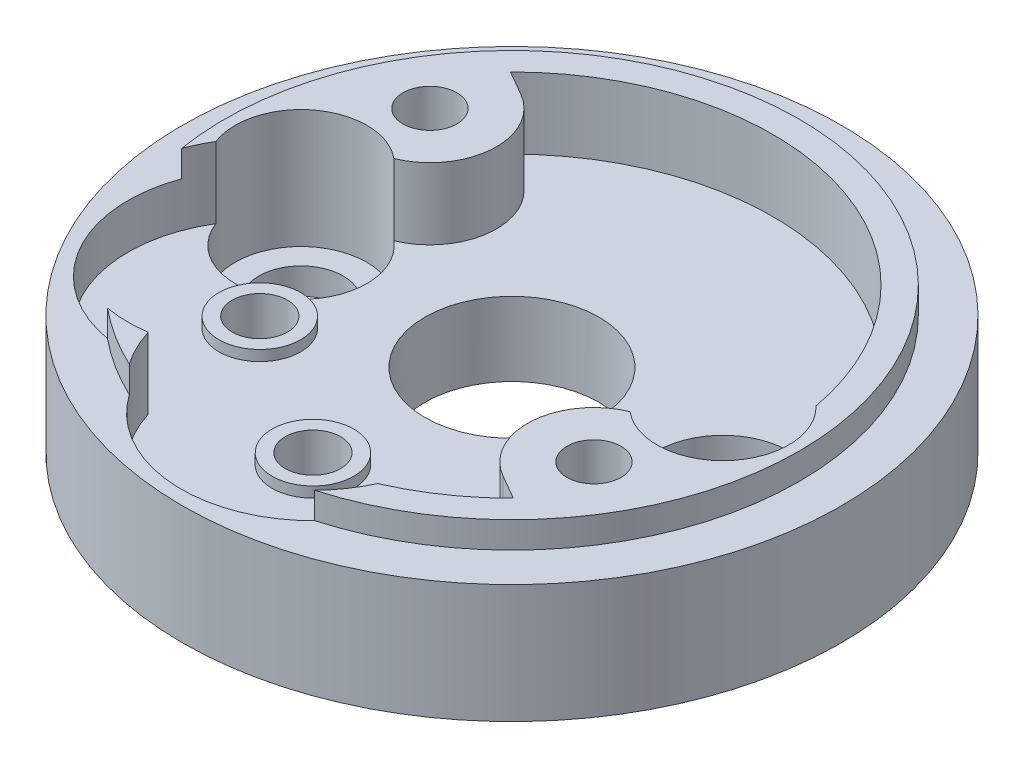
ISO-10303-21;
HEADER;
FILE_DESCRIPTION(('STEP AP214'),'2;1');
FILE_NAME('part.step','',(''),(''),'','','');
FILE_SCHEMA(('AUTOMOTIVE_DESIGN { 1 0 10303 214 1 1 1 1 }'));
ENDSEC;
DATA;
#1=APPLICATION_CONTEXT('core data for automotive mechanical design processes');
#2=APPLICATION_PROTOCOL_DEFINITION('international standard','automotive_design',2000,#1);
#3=PRODUCT_CONTEXT('',#1,'mechanical');
#4=PRODUCT('Part','Part','',(#3));
#5=PRODUCT_RELATED_PRODUCT_CATEGORY('part','',(#4));
#6=PRODUCT_DEFINITION_FORMATION('','',#4);
#7=PRODUCT_DEFINITION_CONTEXT('part definition',#1,'design');
#8=PRODUCT_DEFINITION('design','',#6,#7);
#9=PRODUCT_DEFINITION_SHAPE('','',#8);
#10=(LENGTH_UNIT() NAMED_UNIT(*) SI_UNIT(.MILLI.,.METRE.));
#11=(NAMED_UNIT(*) PLANE_ANGLE_UNIT() SI_UNIT($,.RADIAN.));
#12=(NAMED_UNIT(*) SI_UNIT($,.STERADIAN.) SOLID_ANGLE_UNIT());
#13=UNCERTAINTY_MEASURE_WITH_UNIT(LENGTH_MEASURE(1.E-05),#10,'distance_accuracy_value','');
#14=(GEOMETRIC_REPRESENTATION_CONTEXT(3) GLOBAL_UNCERTAINTY_ASSIGNED_CONTEXT((#13)) GLOBAL_UNIT_ASSIGNED_CONTEXT((#10,
#11,#12)) REPRESENTATION_CONTEXT('',''));
#15=CARTESIAN_POINT('',(0.,0.,0.));
#16=DIRECTION('',(0.,0.,1.));
#17=DIRECTION('',(1.,0.,0.));
#18=AXIS2_PLACEMENT_3D('',#15,#16,#17);
#19=CARTESIAN_POINT('',(0.,-28.0014285349873,0.));
#20=DIRECTION('',(0.,1.,0.));
#21=DIRECTION('',(0.,0.,1.));
#22=AXIS2_PLACEMENT_3D('',#19,#20,#21);
#23=CYLINDRICAL_SURFACE('',#22,9.9);
#24=DIRECTION('',(0.,-1.,0.));
#25=VECTOR('',#24,1.);
#26=CARTESIAN_POINT('',(3.97122345436406,4.15,9.06859329088634));
#27=LINE('',#26,#25);
#28=CARTESIAN_POINT('',(3.97122345436406,5.5,9.06859329088634));
#29=VERTEX_POINT('',#28);
#30=CARTESIAN_POINT('',(3.97122345436406,2.8,9.06859329088634));
#31=VERTEX_POINT('',#30);
#32=EDGE_CURVE('E186',#29,#31,#27,.T.);
#33=ORIENTED_EDGE('',*,*,#32,.F.);
#34=CARTESIAN_POINT('',(0.,5.5,0.));
#35=DIRECTION('',(0.,1.,0.));
#36=DIRECTION('',(0.,0.,1.));
#37=AXIS2_PLACEMENT_3D('',#34,#35,#36);
#38=CIRCLE('',#37,9.9);
#39=CARTESIAN_POINT('',(7.02760140167179,5.5,6.97300642042015));
#40=VERTEX_POINT('',#39);
#41=EDGE_CURVE('E287',#29,#40,#38,.T.);
#42=ORIENTED_EDGE('',*,*,#41,.T.);
#43=DIRECTION('',(0.,-1.,0.));
#44=VECTOR('',#43,1.);
#45=CARTESIAN_POINT('',(7.02760140167179,12.414266167055,6.97300642042015));
#46=LINE('',#45,#44);
#47=CARTESIAN_POINT('',(7.02760140167179,2.8,6.97300642042015));
#48=VERTEX_POINT('',#47);
#49=EDGE_CURVE('E225',#40,#48,#46,.T.);
#50=ORIENTED_EDGE('',*,*,#49,.T.);
#51=CARTESIAN_POINT('',(0.,2.8,0.));
#52=DIRECTION('',(0.,1.,0.));
#53=DIRECTION('',(0.,0.,1.));
#54=AXIS2_PLACEMENT_3D('',#51,#52,#53);
#55=CIRCLE('',#54,9.9);
#56=EDGE_CURVE('E290',#48,#31,#55,.F.);
#57=ORIENTED_EDGE('',*,*,#56,.T.);
#58=EDGE_LOOP('',(#33,#42,#50,#57));
#59=FACE_BOUND('',#58,.T.);
#60=ADVANCED_FACE('F37',(#59),#23,.F.);
#61=CARTESIAN_POINT('',(0.,4.5,0.));
#62=DIRECTION('',(0.,1.,0.));
#63=DIRECTION('',(0.,0.,1.));
#64=AXIS2_PLACEMENT_3D('',#61,#62,#63);
#65=CYLINDRICAL_SURFACE('',#64,10.9);
#66=CARTESIAN_POINT('',(0.,5.5,0.));
#67=DIRECTION('',(0.,1.,0.));
#68=DIRECTION('',(0.,0.,1.));
#69=AXIS2_PLACEMENT_3D('',#66,#67,#68);
#70=CIRCLE('',#69,10.9);
#71=CARTESIAN_POINT('',(2.99765477895542,5.5,10.4796977926945));
#72=VERTEX_POINT('',#71);
#73=CARTESIAN_POINT('',(-10.754717449331,5.5,1.7737115281397));
#74=VERTEX_POINT('',#73);
#75=EDGE_CURVE('E299',#72,#74,#70,.T.);
#76=ORIENTED_EDGE('',*,*,#75,.F.);
#77=DIRECTION('',(0.,-1.,0.));
#78=VECTOR('',#77,1.);
#79=CARTESIAN_POINT('',(2.99765477895542,4.15,10.4796977926945));
#80=LINE('',#79,#78);
#81=CARTESIAN_POINT('',(2.99765477895542,4.5,10.4796977926945));
#82=VERTEX_POINT('',#81);
#83=EDGE_CURVE('E183',#72,#82,#80,.T.);
#84=ORIENTED_EDGE('',*,*,#83,.T.);
#85=CARTESIAN_POINT('',(0.,4.5,0.));
#86=DIRECTION('',(0.,1.,0.));
#87=DIRECTION('',(0.,0.,1.));
#88=AXIS2_PLACEMENT_3D('',#85,#86,#87);
#89=CIRCLE('',#88,10.9);
#90=CARTESIAN_POINT('',(-10.754717449331,4.5,1.7737115281397));
#91=VERTEX_POINT('',#90);
#92=EDGE_CURVE('E294',#82,#91,#89,.T.);
#93=ORIENTED_EDGE('',*,*,#92,.T.);
#94=DIRECTION('',(0.,-1.,0.));
#95=VECTOR('',#94,1.);
#96=CARTESIAN_POINT('',(-10.754717449331,4.15,1.7737115281397));
#97=LINE('',#96,#95);
#98=EDGE_CURVE('E162',#91,#74,#97,.F.);
#99=ORIENTED_EDGE('',*,*,#98,.T.);
#100=EDGE_LOOP('',(#76,#84,#93,#99));
#101=FACE_BOUND('',#100,.T.);
#102=ADVANCED_FACE('F404',(#101),#65,.T.);
#103=CARTESIAN_POINT('',(-6.91343796701989,4.5,8.42700275757448));
#104=VERTEX_POINT('',#103);
#105=CARTESIAN_POINT('',(-4.65937752600439,4.5,9.8539434273881));
#106=VERTEX_POINT('',#105);
#107=EDGE_CURVE('E298',#104,#106,#89,.T.);
#108=ORIENTED_EDGE('',*,*,#107,.T.);
#109=DIRECTION('',(0.,-1.,0.));
#110=VECTOR('',#109,1.);
#111=CARTESIAN_POINT('',(-4.65937752600439,4.15,9.8539434273881));
#112=LINE('',#111,#110);
#113=CARTESIAN_POINT('',(-4.65937752600439,5.5,9.8539434273881));
#114=VERTEX_POINT('',#113);
#115=EDGE_CURVE('E178',#106,#114,#112,.F.);
#116=ORIENTED_EDGE('',*,*,#115,.T.);
#117=CARTESIAN_POINT('',(-6.91343796701989,5.5,8.42700275757448));
#118=VERTEX_POINT('',#117);
#119=EDGE_CURVE('E165',#118,#114,#70,.T.);
#120=ORIENTED_EDGE('',*,*,#119,.F.);
#121=DIRECTION('',(0.,-1.,0.));
#122=VECTOR('',#121,1.);
#123=CARTESIAN_POINT('',(-6.91343796701989,4.15,8.42700275757448));
#124=LINE('',#123,#122);
#125=EDGE_CURVE('E149',#118,#104,#124,.T.);
#126=ORIENTED_EDGE('',*,*,#125,.T.);
#127=EDGE_LOOP('',(#108,#116,#120,#126));
#128=FACE_BOUND('',#127,.T.);
#129=ADVANCED_FACE('F409',(#128),#65,.T.);
#130=CARTESIAN_POINT('',(0.,5.5,0.));
#131=DIRECTION('',(0.,1.,0.));
#132=DIRECTION('',(0.,0.,1.));
#133=AXIS2_PLACEMENT_3D('',#130,#131,#132);
#134=PLANE('',#133);
#135=CARTESIAN_POINT('',(7.36121593216775,5.5,4.24999999999996));
#136=DIRECTION('',(0.,1.,0.));
#137=DIRECTION('',(0.,0.,1.));
#138=AXIS2_PLACEMENT_3D('',#135,#136,#137);
#139=CIRCLE('',#138,1.025);
#140=CARTESIAN_POINT('',(7.36121593216775,5.5,5.27499999999996));
#141=VERTEX_POINT('',#140);
#142=EDGE_CURVE('E211',#141,#141,#139,.T.);
#143=ORIENTED_EDGE('',*,*,#142,.F.);
#144=EDGE_LOOP('',(#143));
#145=FACE_BOUND('',#144,.T.);
#146=CARTESIAN_POINT('',(-7.36121593216775,5.5,-4.24999999999996));
#147=DIRECTION('',(0.,1.,0.));
#148=DIRECTION('',(0.,0.,1.));
#149=AXIS2_PLACEMENT_3D('',#146,#147,#148);
#150=CIRCLE('',#149,1.025);
#151=CARTESIAN_POINT('',(-7.36121593216775,5.5,-3.22499999999996));
#152=VERTEX_POINT('',#151);
#153=EDGE_CURVE('E232',#152,#152,#150,.T.);
#154=ORIENTED_EDGE('',*,*,#153,.F.);
#155=EDGE_LOOP('',(#154));
#156=FACE_BOUND('',#155,.T.);
#157=ORIENTED_EDGE('',*,*,#41,.F.);
#158=CARTESIAN_POINT('',(-0.570159054725856,5.5,6.97674126310516));
#159=DIRECTION('',(0.,1.,0.));
#160=DIRECTION('',(0.,0.,1.));
#161=AXIS2_PLACEMENT_3D('',#158,#159,#160);
#162=CIRCLE('',#161,5.);
#163=EDGE_CURVE('E166',#72,#29,#162,.T.);
#164=ORIENTED_EDGE('',*,*,#163,.F.);
#165=ORIENTED_EDGE('',*,*,#75,.T.);
#166=CARTESIAN_POINT('',(-6.06217782649109,5.5,3.49999999999996));
#167=DIRECTION('',(0.,1.,0.));
#168=DIRECTION('',(0.,0.,1.));
#169=AXIS2_PLACEMENT_3D('',#166,#167,#168);
#170=CIRCLE('',#169,5.);
#171=CARTESIAN_POINT('',(-10.3326244465103,5.5,0.899368217996572));
#172=VERTEX_POINT('',#171);
#173=EDGE_CURVE('E154',#172,#74,#170,.T.);
#174=ORIENTED_EDGE('',*,*,#173,.F.);
#175=CARTESIAN_POINT('',(-8.,5.5,0.));
#176=DIRECTION('',(0.,-1.,0.));
#177=DIRECTION('',(0.,0.,-1.));
#178=AXIS2_PLACEMENT_3D('',#175,#176,#177);
#179=CIRCLE('',#178,2.5);
#180=CARTESIAN_POINT('',(-6.39533392961425,5.5,-1.91704115828345));
#181=VERTEX_POINT('',#180);
#182=EDGE_CURVE('E263',#172,#181,#179,.T.);
#183=ORIENTED_EDGE('',*,*,#182,.T.);
#184=CARTESIAN_POINT('',(-7.36121593216775,5.5,-4.24999999999996));
#185=DIRECTION('',(0.,1.,0.));
#186=DIRECTION('',(0.,0.,1.));
#187=AXIS2_PLACEMENT_3D('',#184,#185,#186);
#188=CIRCLE('',#187,2.525);
#189=CARTESIAN_POINT('',(-6.09871593216776,5.5,-6.43671414455567));
#190=VERTEX_POINT('',#189);
#191=EDGE_CURVE('E238',#181,#190,#188,.T.);
#192=ORIENTED_EDGE('',*,*,#191,.T.);
#193=DIRECTION('',(-0.866025403784442,0.,-0.499999999999995));
#194=VECTOR('',#193,1.);
#195=CARTESIAN_POINT('',(-7.02760140167179,5.5,-6.97300642042015));
#196=LINE('',#195,#194);
#197=CARTESIAN_POINT('',(-7.02760140167179,5.5,-6.97300642042015));
#198=VERTEX_POINT('',#197);
#199=EDGE_CURVE('E235',#190,#198,#196,.T.);
#200=ORIENTED_EDGE('',*,*,#199,.T.);
#201=CARTESIAN_POINT('',(9.735,5.5,-1.79993749891489));
#202=VERTEX_POINT('',#201);
#203=EDGE_CURVE('E289',#202,#198,#38,.T.);
#204=ORIENTED_EDGE('',*,*,#203,.F.);
#205=CARTESIAN_POINT('',(8.,5.5,0.));
#206=DIRECTION('',(0.,-1.,0.));
#207=DIRECTION('',(0.,0.,-1.));
#208=AXIS2_PLACEMENT_3D('',#205,#206,#207);
#209=CIRCLE('',#208,2.5);
#210=CARTESIAN_POINT('',(6.39533392961425,5.5,1.91704115828345));
#211=VERTEX_POINT('',#210);
#212=EDGE_CURVE('E269',#202,#211,#209,.T.);
#213=ORIENTED_EDGE('',*,*,#212,.T.);
#214=CARTESIAN_POINT('',(7.36121593216775,5.5,4.24999999999996));
#215=DIRECTION('',(0.,1.,0.));
#216=DIRECTION('',(0.,0.,1.));
#217=AXIS2_PLACEMENT_3D('',#214,#215,#216);
#218=CIRCLE('',#217,2.525);
#219=CARTESIAN_POINT('',(6.09871593216776,5.5,6.43671414455567));
#220=VERTEX_POINT('',#219);
#221=EDGE_CURVE('E217',#211,#220,#218,.T.);
#222=ORIENTED_EDGE('',*,*,#221,.T.);
#223=DIRECTION('',(0.866025403784442,0.,0.499999999999995));
#224=VECTOR('',#223,1.);
#225=CARTESIAN_POINT('',(7.02760140167179,5.5,6.97300642042015));
#226=LINE('',#225,#224);
#227=EDGE_CURVE('E214',#220,#40,#226,.T.);
#228=ORIENTED_EDGE('',*,*,#227,.T.);
#229=EDGE_LOOP('',(#157,#164,#165,#174,#183,#192,#200,#204,#213,#222,#228));
#230=FACE_BOUND('',#229,.T.);
#231=ADVANCED_FACE('F342',(#145,#156,#230),#134,.T.);
#232=CARTESIAN_POINT('',(-8.,5.5,0.));
#233=DIRECTION('',(0.,-1.,0.));
#234=DIRECTION('',(0.,0.,-1.));
#235=AXIS2_PLACEMENT_3D('',#232,#233,#234);
#236=CYLINDRICAL_SURFACE('',#235,2.5);
#237=CARTESIAN_POINT('',(-8.,1.,0.));
#238=DIRECTION('',(0.,-1.,0.));
#239=DIRECTION('',(0.,0.,-1.));
#240=AXIS2_PLACEMENT_3D('',#237,#238,#239);
#241=CIRCLE('',#240,2.5);
#242=CARTESIAN_POINT('',(-8.,1.,-2.5));
#243=VERTEX_POINT('',#242);
#244=EDGE_CURVE('E266',#243,#243,#241,.T.);
#245=ORIENTED_EDGE('',*,*,#244,.T.);
#246=EDGE_LOOP('',(#245));
#247=FACE_BOUND('',#246,.T.);
#248=DIRECTION('',(0.,-1.,0.));
#249=VECTOR('',#248,1.);
#250=CARTESIAN_POINT('',(-10.3326244465103,4.15,0.899368217996571));
#251=LINE('',#250,#249);
#252=CARTESIAN_POINT('',(-10.3326244465103,2.8,0.899368217996573));
#253=VERTEX_POINT('',#252);
#254=EDGE_CURVE('E13',#253,#172,#251,.F.);
#255=ORIENTED_EDGE('',*,*,#254,.F.);
#256=CARTESIAN_POINT('',(-8.,2.8,0.));
#257=DIRECTION('',(0.,1.,0.));
#258=DIRECTION('',(0.,0.,1.));
#259=AXIS2_PLACEMENT_3D('',#256,#257,#258);
#260=CIRCLE('',#259,2.5);
#261=CARTESIAN_POINT('',(-7.0660193673345,2.8,2.31898257384693));
#262=VERTEX_POINT('',#261);
#263=EDGE_CURVE('E45',#253,#262,#260,.T.);
#264=ORIENTED_EDGE('',*,*,#263,.T.);
#265=CARTESIAN_POINT('',(-8.,2.8,0.));
#266=DIRECTION('',(0.,1.,0.));
#267=DIRECTION('',(0.,0.,1.));
#268=AXIS2_PLACEMENT_3D('',#265,#266,#267);
#269=CIRCLE('',#268,2.5);
#270=CARTESIAN_POINT('',(-6.53032286325913,2.8,2.02238698417023));
#271=VERTEX_POINT('',#270);
#272=EDGE_CURVE('E204',#271,#262,#269,.F.);
#273=ORIENTED_EDGE('',*,*,#272,.F.);
#274=CARTESIAN_POINT('',(-6.39533392961425,2.8,-1.91704115828345));
#275=VERTEX_POINT('',#274);
#276=EDGE_CURVE('E315',#271,#275,#260,.T.);
#277=ORIENTED_EDGE('',*,*,#276,.T.);
#278=DIRECTION('',(0.,-1.,0.));
#279=VECTOR('',#278,1.);
#280=CARTESIAN_POINT('',(-6.39533392961425,12.414266167055,-1.91704115828345));
#281=LINE('',#280,#279);
#282=EDGE_CURVE('E251',#181,#275,#281,.T.);
#283=ORIENTED_EDGE('',*,*,#282,.F.);
#284=ORIENTED_EDGE('',*,*,#182,.F.);
#285=EDGE_LOOP('',(#255,#264,#273,#277,#283,#284));
#286=FACE_BOUND('',#285,.T.);
#287=ADVANCED_FACE('F321',(#247,#286),#236,.F.);
#288=CARTESIAN_POINT('',(0.,2.8,0.));
#289=DIRECTION('',(0.,1.,0.));
#290=DIRECTION('',(0.,0.,1.));
#291=AXIS2_PLACEMENT_3D('',#288,#289,#290);
#292=PLANE('',#291);
#293=CARTESIAN_POINT('',(-0.570159054725856,2.8,6.97674126310516));
#294=DIRECTION('',(0.,1.,0.));
#295=DIRECTION('',(0.,0.,1.));
#296=AXIS2_PLACEMENT_3D('',#293,#294,#295);
#297=CIRCLE('',#296,5.);
#298=CARTESIAN_POINT('',(-5.34854891528625,2.8,8.44881134991952));
#299=VERTEX_POINT('',#298);
#300=EDGE_CURVE('E161',#299,#31,#297,.T.);
#301=ORIENTED_EDGE('',*,*,#300,.T.);
#302=ORIENTED_EDGE('',*,*,#56,.F.);
#303=DIRECTION('',(0.866025403784442,0.,0.499999999999995));
#304=VECTOR('',#303,1.);
#305=CARTESIAN_POINT('',(7.02760140167179,2.8,6.97300642042015));
#306=LINE('',#305,#304);
#307=CARTESIAN_POINT('',(6.09871593216776,2.8,6.43671414455567));
#308=VERTEX_POINT('',#307);
#309=EDGE_CURVE('E223',#308,#48,#306,.T.);
#310=ORIENTED_EDGE('',*,*,#309,.F.);
#311=CARTESIAN_POINT('',(7.36121593216775,2.8,4.24999999999996));
#312=DIRECTION('',(0.,1.,0.));
#313=DIRECTION('',(0.,0.,1.));
#314=AXIS2_PLACEMENT_3D('',#311,#312,#313);
#315=CIRCLE('',#314,2.525);
#316=CARTESIAN_POINT('',(6.39533392961425,2.8,1.91704115828345));
#317=VERTEX_POINT('',#316);
#318=EDGE_CURVE('E220',#317,#308,#315,.T.);
#319=ORIENTED_EDGE('',*,*,#318,.F.);
#320=CARTESIAN_POINT('',(8.,2.8,0.));
#321=DIRECTION('',(0.,1.,0.));
#322=DIRECTION('',(0.,0.,1.));
#323=AXIS2_PLACEMENT_3D('',#320,#321,#322);
#324=CIRCLE('',#323,2.5);
#325=CARTESIAN_POINT('',(9.735,2.8,-1.7999374989149));
#326=VERTEX_POINT('',#325);
#327=EDGE_CURVE('E305',#326,#317,#324,.T.);
#328=ORIENTED_EDGE('',*,*,#327,.F.);
#329=CARTESIAN_POINT('',(-7.02760140167179,2.8,-6.97300642042015));
#330=VERTEX_POINT('',#329);
#331=EDGE_CURVE('E293',#330,#326,#55,.F.);
#332=ORIENTED_EDGE('',*,*,#331,.F.);
#333=DIRECTION('',(-0.866025403784442,0.,-0.499999999999995));
#334=VECTOR('',#333,1.);
#335=CARTESIAN_POINT('',(-7.02760140167179,2.8,-6.97300642042015));
#336=LINE('',#335,#334);
#337=CARTESIAN_POINT('',(-6.09871593216776,2.8,-6.43671414455567));
#338=VERTEX_POINT('',#337);
#339=EDGE_CURVE('E244',#338,#330,#336,.T.);
#340=ORIENTED_EDGE('',*,*,#339,.F.);
#341=CARTESIAN_POINT('',(-7.36121593216775,2.8,-4.24999999999996));
#342=DIRECTION('',(0.,1.,0.));
#343=DIRECTION('',(0.,0.,-1.));
#344=AXIS2_PLACEMENT_3D('',#341,#342,#343);
#345=CIRCLE('',#344,2.525);
#346=EDGE_CURVE('E241',#275,#338,#345,.T.);
#347=ORIENTED_EDGE('',*,*,#346,.F.);
#348=ORIENTED_EDGE('',*,*,#276,.F.);
#349=CARTESIAN_POINT('',(-6.06217782649109,2.8,3.49999999999996));
#350=DIRECTION('',(0.,1.,0.));
#351=DIRECTION('',(0.,0.,1.));
#352=AXIS2_PLACEMENT_3D('',#349,#350,#351);
#353=CIRCLE('',#352,1.55);
#354=EDGE_CURVE('E200',#262,#271,#353,.T.);
#355=ORIENTED_EDGE('',*,*,#354,.F.);
#356=ORIENTED_EDGE('',*,*,#263,.F.);
#357=CARTESIAN_POINT('',(-6.06217782649109,2.8,3.49999999999996));
#358=DIRECTION('',(0.,1.,0.));
#359=DIRECTION('',(0.,0.,1.));
#360=AXIS2_PLACEMENT_3D('',#357,#358,#359);
#361=CIRCLE('',#360,5.);
#362=EDGE_CURVE('E168',#253,#299,#361,.T.);
#363=ORIENTED_EDGE('',*,*,#362,.T.);
#364=EDGE_LOOP('',(#301,#302,#310,#319,#328,#332,#340,#347,#348,#355,#356,#363));
#365=FACE_BOUND('',#364,.T.);
#366=CARTESIAN_POINT('',(0.,2.8,0.));
#367=DIRECTION('',(0.,1.,0.));
#368=DIRECTION('',(0.,0.,1.));
#369=AXIS2_PLACEMENT_3D('',#366,#367,#368);
#370=CIRCLE('',#369,3.3);
#371=CARTESIAN_POINT('',(0.,2.8,3.3));
#372=VERTEX_POINT('',#371);
#373=EDGE_CURVE('E286',#372,#372,#370,.T.);
#374=ORIENTED_EDGE('',*,*,#373,.F.);
#375=EDGE_LOOP('',(#374));
#376=FACE_BOUND('',#375,.T.);
#377=CARTESIAN_POINT('',(-0.570159054725856,2.8,6.97674126310516));
#378=DIRECTION('',(0.,1.,0.));
#379=DIRECTION('',(0.,0.,1.));
#380=AXIS2_PLACEMENT_3D('',#377,#378,#379);
#381=CIRCLE('',#380,1.55);
#382=CARTESIAN_POINT('',(-0.570159054725856,2.8,8.52674126310516));
#383=VERTEX_POINT('',#382);
#384=EDGE_CURVE('E191',#383,#383,#381,.T.);
#385=ORIENTED_EDGE('',*,*,#384,.F.);
#386=EDGE_LOOP('',(#385));
#387=FACE_BOUND('',#386,.T.);
#388=ADVANCED_FACE('F328',(#365,#376,#387),#292,.T.);
#389=DIRECTION('',(0.,-1.,0.));
#390=VECTOR('',#389,1.);
#391=CARTESIAN_POINT('',(-7.02760140167179,12.414266167055,-6.97300642042015));
#392=LINE('',#391,#390);
#393=EDGE_CURVE('E246',#198,#330,#392,.T.);
#394=ORIENTED_EDGE('',*,*,#393,.T.);
#395=ORIENTED_EDGE('',*,*,#331,.T.);
#396=DIRECTION('',(0.,-1.,0.));
#397=VECTOR('',#396,1.);
#398=CARTESIAN_POINT('',(9.735,3.25,-1.7999374989149));
#399=LINE('',#398,#397);
#400=EDGE_CURVE('E273',#326,#202,#399,.F.);
#401=ORIENTED_EDGE('',*,*,#400,.T.);
#402=ORIENTED_EDGE('',*,*,#203,.T.);
#403=EDGE_LOOP('',(#394,#395,#401,#402));
#404=FACE_BOUND('',#403,.T.);
#405=ADVANCED_FACE('F337',(#404),#23,.F.);
#406=CARTESIAN_POINT('',(0.,5.5,0.));
#407=DIRECTION('',(0.,-1.,0.));
#408=DIRECTION('',(0.,0.,-1.));
#409=AXIS2_PLACEMENT_3D('',#406,#407,#408);
#410=CYLINDRICAL_SURFACE('',#409,12.5);
#411=CARTESIAN_POINT('',(0.,0.,0.));
#412=DIRECTION('',(0.,1.,0.));
#413=DIRECTION('',(0.,0.,1.));
#414=AXIS2_PLACEMENT_3D('',#411,#412,#413);
#415=CIRCLE('',#414,12.5);
#416=CARTESIAN_POINT('',(0.,0.,12.5));
#417=VERTEX_POINT('',#416);
#418=EDGE_CURVE('E302',#417,#417,#415,.T.);
#419=ORIENTED_EDGE('',*,*,#418,.T.);
#420=EDGE_LOOP('',(#419));
#421=FACE_BOUND('',#420,.T.);
#422=CARTESIAN_POINT('',(0.,4.5,0.));
#423=DIRECTION('',(0.,1.,0.));
#424=DIRECTION('',(0.,0.,1.));
#425=AXIS2_PLACEMENT_3D('',#422,#423,#424);
#426=CIRCLE('',#425,12.5);
#427=CARTESIAN_POINT('',(0.,4.5,12.5));
#428=VERTEX_POINT('',#427);
#429=EDGE_CURVE('E297',#428,#428,#426,.T.);
#430=ORIENTED_EDGE('',*,*,#429,.F.);
#431=EDGE_LOOP('',(#430));
#432=FACE_BOUND('',#431,.T.);
#433=ADVANCED_FACE('F39',(#421,#432),#410,.T.);
#434=CARTESIAN_POINT('',(0.,0.,0.));
#435=DIRECTION('',(0.,1.,0.));
#436=DIRECTION('',(0.,0.,1.));
#437=AXIS2_PLACEMENT_3D('',#434,#435,#436);
#438=PLANE('',#437);
#439=CARTESIAN_POINT('',(-6.06217782649109,0.,3.49999999999997));
#440=DIRECTION('',(0.,1.,0.));
#441=DIRECTION('',(0.,0.,1.));
#442=AXIS2_PLACEMENT_3D('',#439,#440,#441);
#443=CIRCLE('',#442,1.05);
#444=CARTESIAN_POINT('',(-6.06217782649109,0.,4.54999999999996));
#445=VERTEX_POINT('',#444);
#446=EDGE_CURVE('E208',#445,#445,#443,.T.);
#447=ORIENTED_EDGE('',*,*,#446,.T.);
#448=EDGE_LOOP('',(#447));
#449=FACE_BOUND('',#448,.T.);
#450=CARTESIAN_POINT('',(-0.570159054725855,0.,6.97674126310516));
#451=DIRECTION('',(0.,1.,0.));
#452=DIRECTION('',(0.,0.,1.));
#453=AXIS2_PLACEMENT_3D('',#450,#451,#452);
#454=CIRCLE('',#453,1.05);
#455=CARTESIAN_POINT('',(-0.570159054725855,0.,8.02674126310516));
#456=VERTEX_POINT('',#455);
#457=EDGE_CURVE('E207',#456,#456,#454,.T.);
#458=ORIENTED_EDGE('',*,*,#457,.T.);
#459=EDGE_LOOP('',(#458));
#460=FACE_BOUND('',#459,.T.);
#461=CARTESIAN_POINT('',(-7.36121593216775,0.,-4.24999999999996));
#462=DIRECTION('',(0.,-1.,0.));
#463=DIRECTION('',(0.,0.,-1.));
#464=AXIS2_PLACEMENT_3D('',#461,#462,#463);
#465=CIRCLE('',#464,1.025);
#466=CARTESIAN_POINT('',(-7.36121593216775,0.,-5.27499999999996));
#467=VERTEX_POINT('',#466);
#468=EDGE_CURVE('E257',#467,#467,#465,.T.);
#469=ORIENTED_EDGE('',*,*,#468,.F.);
#470=EDGE_LOOP('',(#469));
#471=FACE_BOUND('',#470,.T.);
#472=CARTESIAN_POINT('',(7.36121593216775,0.,4.24999999999996));
#473=DIRECTION('',(0.,-1.,0.));
#474=DIRECTION('',(0.,0.,-1.));
#475=AXIS2_PLACEMENT_3D('',#472,#473,#474);
#476=CIRCLE('',#475,1.025);
#477=CARTESIAN_POINT('',(7.36121593216775,0.,3.22499999999996));
#478=VERTEX_POINT('',#477);
#479=EDGE_CURVE('E254',#478,#478,#476,.T.);
#480=ORIENTED_EDGE('',*,*,#479,.F.);
#481=EDGE_LOOP('',(#480));
#482=FACE_BOUND('',#481,.T.);
#483=CARTESIAN_POINT('',(-8.,0.,0.));
#484=DIRECTION('',(0.,-1.,0.));
#485=DIRECTION('',(0.,0.,-1.));
#486=AXIS2_PLACEMENT_3D('',#483,#484,#485);
#487=CIRCLE('',#486,1.6);
#488=CARTESIAN_POINT('',(-8.,0.,-1.6));
#489=VERTEX_POINT('',#488);
#490=EDGE_CURVE('E276',#489,#489,#487,.T.);
#491=ORIENTED_EDGE('',*,*,#490,.F.);
#492=EDGE_LOOP('',(#491));
#493=FACE_BOUND('',#492,.T.);
#494=CARTESIAN_POINT('',(8.,0.,0.));
#495=DIRECTION('',(0.,-1.,0.));
#496=DIRECTION('',(0.,0.,-1.));
#497=AXIS2_PLACEMENT_3D('',#494,#495,#496);
#498=CIRCLE('',#497,1.6);
#499=CARTESIAN_POINT('',(8.,0.,-1.6));
#500=VERTEX_POINT('',#499);
#501=EDGE_CURVE('E278',#500,#500,#498,.T.);
#502=ORIENTED_EDGE('',*,*,#501,.F.);
#503=EDGE_LOOP('',(#502));
#504=FACE_BOUND('',#503,.T.);
#505=CARTESIAN_POINT('',(0.,0.,0.));
#506=DIRECTION('',(0.,-1.,0.));
#507=DIRECTION('',(0.,0.,-1.));
#508=AXIS2_PLACEMENT_3D('',#505,#506,#507);
#509=CIRCLE('',#508,3.3);
#510=CARTESIAN_POINT('',(0.,0.,-3.3));
#511=VERTEX_POINT('',#510);
#512=EDGE_CURVE('E281',#511,#511,#509,.T.);
#513=ORIENTED_EDGE('',*,*,#512,.F.);
#514=EDGE_LOOP('',(#513));
#515=FACE_BOUND('',#514,.T.);
#516=ORIENTED_EDGE('',*,*,#418,.F.);
#517=EDGE_LOOP('',(#516));
#518=FACE_BOUND('',#517,.T.);
#519=ADVANCED_FACE('F381',(#449,#460,#471,#482,#493,#504,#515,#518),#438,.F.);
#520=CARTESIAN_POINT('',(0.,4.5,0.));
#521=DIRECTION('',(0.,1.,0.));
#522=DIRECTION('',(0.,0.,1.));
#523=AXIS2_PLACEMENT_3D('',#520,#521,#522);
#524=PLANE('',#523);
#525=ORIENTED_EDGE('',*,*,#92,.F.);
#526=CARTESIAN_POINT('',(-0.570159054725856,4.5,6.97674126310516));
#527=DIRECTION('',(0.,1.,0.));
#528=DIRECTION('',(0.,0.,1.));
#529=AXIS2_PLACEMENT_3D('',#526,#527,#528);
#530=CIRCLE('',#529,5.);
#531=EDGE_CURVE('E180',#82,#106,#530,.F.);
#532=ORIENTED_EDGE('',*,*,#531,.T.);
#533=ORIENTED_EDGE('',*,*,#107,.F.);
#534=CARTESIAN_POINT('',(-6.06217782649109,4.5,3.49999999999996));
#535=DIRECTION('',(0.,1.,0.));
#536=DIRECTION('',(0.,0.,1.));
#537=AXIS2_PLACEMENT_3D('',#534,#535,#536);
#538=CIRCLE('',#537,5.);
#539=EDGE_CURVE('E174',#104,#91,#538,.F.);
#540=ORIENTED_EDGE('',*,*,#539,.T.);
#541=EDGE_LOOP('',(#525,#532,#533,#540));
#542=FACE_BOUND('',#541,.T.);
#543=ORIENTED_EDGE('',*,*,#429,.T.);
#544=EDGE_LOOP('',(#543));
#545=FACE_BOUND('',#544,.T.);
#546=ADVANCED_FACE('F384',(#542,#545),#524,.T.);
#547=ORIENTED_EDGE('',*,*,#119,.T.);
#548=CARTESIAN_POINT('',(-5.34854891528625,5.5,8.44881134991952));
#549=VERTEX_POINT('',#548);
#550=EDGE_CURVE('E155',#549,#114,#162,.T.);
#551=ORIENTED_EDGE('',*,*,#550,.F.);
#552=EDGE_CURVE('E143',#118,#549,#170,.T.);
#553=ORIENTED_EDGE('',*,*,#552,.F.);
#554=EDGE_LOOP('',(#547,#551,#553));
#555=FACE_BOUND('',#554,.T.);
#556=ADVANCED_FACE('F164',(#555),#134,.T.);
#557=CARTESIAN_POINT('',(0.,5.5,0.));
#558=DIRECTION('',(0.,-1.,0.));
#559=DIRECTION('',(0.,0.,-1.));
#560=AXIS2_PLACEMENT_3D('',#557,#558,#559);
#561=CYLINDRICAL_SURFACE('',#560,3.3);
#562=ORIENTED_EDGE('',*,*,#373,.T.);
#563=EDGE_LOOP('',(#562));
#564=FACE_BOUND('',#563,.T.);
#565=ORIENTED_EDGE('',*,*,#512,.T.);
#566=EDGE_LOOP('',(#565));
#567=FACE_BOUND('',#566,.T.);
#568=ADVANCED_FACE('F377',(#564,#567),#561,.F.);
#569=CARTESIAN_POINT('',(8.,5.5,0.));
#570=DIRECTION('',(0.,-1.,0.));
#571=DIRECTION('',(0.,0.,-1.));
#572=AXIS2_PLACEMENT_3D('',#569,#570,#571);
#573=CYLINDRICAL_SURFACE('',#572,1.6);
#574=CARTESIAN_POINT('',(8.,1.,0.));
#575=DIRECTION('',(0.,-1.,0.));
#576=DIRECTION('',(0.,0.,-1.));
#577=AXIS2_PLACEMENT_3D('',#574,#575,#576);
#578=CIRCLE('',#577,1.6);
#579=CARTESIAN_POINT('',(8.,1.,-1.6));
#580=VERTEX_POINT('',#579);
#581=EDGE_CURVE('E277',#580,#580,#578,.F.);
#582=ORIENTED_EDGE('',*,*,#581,.T.);
#583=EDGE_LOOP('',(#582));
#584=FACE_BOUND('',#583,.T.);
#585=ORIENTED_EDGE('',*,*,#501,.T.);
#586=EDGE_LOOP('',(#585));
#587=FACE_BOUND('',#586,.T.);
#588=ADVANCED_FACE('F373',(#584,#587),#573,.F.);
#589=CARTESIAN_POINT('',(-8.,5.5,0.));
#590=DIRECTION('',(0.,-1.,0.));
#591=DIRECTION('',(0.,0.,-1.));
#592=AXIS2_PLACEMENT_3D('',#589,#590,#591);
#593=CYLINDRICAL_SURFACE('',#592,1.6);
#594=CARTESIAN_POINT('',(-8.,1.,0.));
#595=DIRECTION('',(0.,-1.,0.));
#596=DIRECTION('',(0.,0.,-1.));
#597=AXIS2_PLACEMENT_3D('',#594,#595,#596);
#598=CIRCLE('',#597,1.6);
#599=CARTESIAN_POINT('',(-8.,1.,-1.6));
#600=VERTEX_POINT('',#599);
#601=EDGE_CURVE('E265',#600,#600,#598,.F.);
#602=ORIENTED_EDGE('',*,*,#601,.T.);
#603=EDGE_LOOP('',(#602));
#604=FACE_BOUND('',#603,.T.);
#605=ORIENTED_EDGE('',*,*,#490,.T.);
#606=EDGE_LOOP('',(#605));
#607=FACE_BOUND('',#606,.T.);
#608=ADVANCED_FACE('F376',(#604,#607),#593,.F.);
#609=CARTESIAN_POINT('',(-8.,1.,0.));
#610=DIRECTION('',(0.,-1.,0.));
#611=DIRECTION('',(0.,0.,-1.));
#612=AXIS2_PLACEMENT_3D('',#609,#610,#611);
#613=PLANE('',#612);
#614=ORIENTED_EDGE('',*,*,#244,.F.);
#615=EDGE_LOOP('',(#614));
#616=FACE_BOUND('',#615,.T.);
#617=ORIENTED_EDGE('',*,*,#601,.F.);
#618=EDGE_LOOP('',(#617));
#619=FACE_BOUND('',#618,.T.);
#620=ADVANCED_FACE('F363',(#616,#619),#613,.F.);
#621=CARTESIAN_POINT('',(8.,5.5,0.));
#622=DIRECTION('',(0.,-1.,0.));
#623=DIRECTION('',(0.,0.,-1.));
#624=AXIS2_PLACEMENT_3D('',#621,#622,#623);
#625=CYLINDRICAL_SURFACE('',#624,2.5);
#626=DIRECTION('',(0.,-1.,0.));
#627=VECTOR('',#626,1.);
#628=CARTESIAN_POINT('',(6.39533392961425,12.414266167055,1.91704115828345));
#629=LINE('',#628,#627);
#630=EDGE_CURVE('E230',#211,#317,#629,.T.);
#631=ORIENTED_EDGE('',*,*,#630,.F.);
#632=ORIENTED_EDGE('',*,*,#212,.F.);
#633=ORIENTED_EDGE('',*,*,#400,.F.);
#634=ORIENTED_EDGE('',*,*,#327,.T.);
#635=EDGE_LOOP('',(#631,#632,#633,#634));
#636=FACE_BOUND('',#635,.T.);
#637=CARTESIAN_POINT('',(8.,1.,0.));
#638=DIRECTION('',(0.,-1.,0.));
#639=DIRECTION('',(0.,0.,-1.));
#640=AXIS2_PLACEMENT_3D('',#637,#638,#639);
#641=CIRCLE('',#640,2.5);
#642=CARTESIAN_POINT('',(8.,1.,-2.5));
#643=VERTEX_POINT('',#642);
#644=EDGE_CURVE('E260',#643,#643,#641,.T.);
#645=ORIENTED_EDGE('',*,*,#644,.T.);
#646=EDGE_LOOP('',(#645));
#647=FACE_BOUND('',#646,.T.);
#648=ADVANCED_FACE('F359',(#636,#647),#625,.F.);
#649=CARTESIAN_POINT('',(8.,1.,0.));
#650=DIRECTION('',(0.,-1.,0.));
#651=DIRECTION('',(0.,0.,-1.));
#652=AXIS2_PLACEMENT_3D('',#649,#650,#651);
#653=PLANE('',#652);
#654=ORIENTED_EDGE('',*,*,#644,.F.);
#655=EDGE_LOOP('',(#654));
#656=FACE_BOUND('',#655,.T.);
#657=ORIENTED_EDGE('',*,*,#581,.F.);
#658=EDGE_LOOP('',(#657));
#659=FACE_BOUND('',#658,.T.);
#660=ADVANCED_FACE('F362',(#656,#659),#653,.F.);
#661=CARTESIAN_POINT('',(7.36121593216775,5.5,4.24999999999996));
#662=DIRECTION('',(0.,-1.,0.));
#663=DIRECTION('',(0.,0.,-1.));
#664=AXIS2_PLACEMENT_3D('',#661,#662,#663);
#665=CYLINDRICAL_SURFACE('',#664,1.025);
#666=ORIENTED_EDGE('',*,*,#479,.T.);
#667=EDGE_LOOP('',(#666));
#668=FACE_BOUND('',#667,.T.);
#669=ORIENTED_EDGE('',*,*,#142,.T.);
#670=EDGE_LOOP('',(#669));
#671=FACE_BOUND('',#670,.T.);
#672=ADVANCED_FACE('F369',(#668,#671),#665,.F.);
#673=CARTESIAN_POINT('',(-7.36121593216775,5.5,-4.24999999999996));
#674=DIRECTION('',(0.,-1.,0.));
#675=DIRECTION('',(0.,0.,-1.));
#676=AXIS2_PLACEMENT_3D('',#673,#674,#675);
#677=CYLINDRICAL_SURFACE('',#676,1.025);
#678=ORIENTED_EDGE('',*,*,#468,.T.);
#679=EDGE_LOOP('',(#678));
#680=FACE_BOUND('',#679,.T.);
#681=ORIENTED_EDGE('',*,*,#153,.T.);
#682=EDGE_LOOP('',(#681));
#683=FACE_BOUND('',#682,.T.);
#684=ADVANCED_FACE('F433',(#680,#683),#677,.F.);
#685=CARTESIAN_POINT('',(-7.02760140167179,12.414266167055,-6.97300642042015));
#686=DIRECTION('',(-0.499999999999995,0.,0.866025403784442));
#687=DIRECTION('',(0.866025403784442,0.,0.499999999999995));
#688=AXIS2_PLACEMENT_3D('',#685,#686,#687);
#689=PLANE('',#688);
#690=ORIENTED_EDGE('',*,*,#199,.F.);
#691=DIRECTION('',(0.,-1.,0.));
#692=VECTOR('',#691,1.);
#693=CARTESIAN_POINT('',(-6.09871593216776,12.414266167055,-6.43671414455567));
#694=LINE('',#693,#692);
#695=EDGE_CURVE('E249',#190,#338,#694,.T.);
#696=ORIENTED_EDGE('',*,*,#695,.T.);
#697=ORIENTED_EDGE('',*,*,#339,.T.);
#698=ORIENTED_EDGE('',*,*,#393,.F.);
#699=EDGE_LOOP('',(#690,#696,#697,#698));
#700=FACE_BOUND('',#699,.T.);
#701=ADVANCED_FACE('F334',(#700),#689,.F.);
#702=CARTESIAN_POINT('',(-7.36121593216775,12.414266167055,-4.24999999999996));
#703=DIRECTION('',(0.,-1.,0.));
#704=DIRECTION('',(0.,0.,-1.));
#705=AXIS2_PLACEMENT_3D('',#702,#703,#704);
#706=CYLINDRICAL_SURFACE('',#705,2.525);
#707=ORIENTED_EDGE('',*,*,#191,.F.);
#708=ORIENTED_EDGE('',*,*,#282,.T.);
#709=ORIENTED_EDGE('',*,*,#346,.T.);
#710=ORIENTED_EDGE('',*,*,#695,.F.);
#711=EDGE_LOOP('',(#707,#708,#709,#710));
#712=FACE_BOUND('',#711,.T.);
#713=ADVANCED_FACE('F326',(#712),#706,.T.);
#714=CARTESIAN_POINT('',(7.02760140167179,12.414266167055,6.97300642042015));
#715=DIRECTION('',(0.499999999999995,0.,-0.866025403784442));
#716=DIRECTION('',(-0.866025403784442,0.,-0.499999999999995));
#717=AXIS2_PLACEMENT_3D('',#714,#715,#716);
#718=PLANE('',#717);
#719=ORIENTED_EDGE('',*,*,#227,.F.);
#720=DIRECTION('',(0.,-1.,0.));
#721=VECTOR('',#720,1.);
#722=CARTESIAN_POINT('',(6.09871593216776,12.414266167055,6.43671414455567));
#723=LINE('',#722,#721);
#724=EDGE_CURVE('E228',#220,#308,#723,.T.);
#725=ORIENTED_EDGE('',*,*,#724,.T.);
#726=ORIENTED_EDGE('',*,*,#309,.T.);
#727=ORIENTED_EDGE('',*,*,#49,.F.);
#728=EDGE_LOOP('',(#719,#725,#726,#727));
#729=FACE_BOUND('',#728,.T.);
#730=ADVANCED_FACE('F352',(#729),#718,.F.);
#731=CARTESIAN_POINT('',(7.36121593216775,12.414266167055,4.24999999999996));
#732=DIRECTION('',(0.,-1.,0.));
#733=DIRECTION('',(0.,0.,-1.));
#734=AXIS2_PLACEMENT_3D('',#731,#732,#733);
#735=CYLINDRICAL_SURFACE('',#734,2.525);
#736=ORIENTED_EDGE('',*,*,#221,.F.);
#737=ORIENTED_EDGE('',*,*,#630,.T.);
#738=ORIENTED_EDGE('',*,*,#318,.T.);
#739=ORIENTED_EDGE('',*,*,#724,.F.);
#740=EDGE_LOOP('',(#736,#737,#738,#739));
#741=FACE_BOUND('',#740,.T.);
#742=ADVANCED_FACE('F356',(#741),#735,.T.);
#743=CARTESIAN_POINT('',(-0.570159054725855,0.,6.97674126310516));
#744=DIRECTION('',(0.,1.,0.));
#745=DIRECTION('',(0.,0.,1.));
#746=AXIS2_PLACEMENT_3D('',#743,#744,#745);
#747=CYLINDRICAL_SURFACE('',#746,1.05);
#748=ORIENTED_EDGE('',*,*,#457,.F.);
#749=EDGE_LOOP('',(#748));
#750=FACE_BOUND('',#749,.T.);
#751=CARTESIAN_POINT('',(-0.570159054725855,3.2,6.97674126310516));
#752=DIRECTION('',(0.,1.,0.));
#753=DIRECTION('',(0.,0.,1.));
#754=AXIS2_PLACEMENT_3D('',#751,#752,#753);
#755=CIRCLE('',#754,1.05);
#756=CARTESIAN_POINT('',(-0.570159054725855,3.2,8.02674126310516));
#757=VERTEX_POINT('',#756);
#758=EDGE_CURVE('E188',#757,#757,#755,.T.);
#759=ORIENTED_EDGE('',*,*,#758,.T.);
#760=EDGE_LOOP('',(#759));
#761=FACE_BOUND('',#760,.T.);
#762=ADVANCED_FACE('F444',(#750,#761),#747,.F.);
#763=CARTESIAN_POINT('',(-6.06217782649109,0.,3.49999999999997));
#764=DIRECTION('',(0.,1.,0.));
#765=DIRECTION('',(0.,0.,1.));
#766=AXIS2_PLACEMENT_3D('',#763,#764,#765);
#767=CYLINDRICAL_SURFACE('',#766,1.05);
#768=ORIENTED_EDGE('',*,*,#446,.F.);
#769=EDGE_LOOP('',(#768));
#770=FACE_BOUND('',#769,.T.);
#771=CARTESIAN_POINT('',(-6.06217782649109,3.2,3.49999999999997));
#772=DIRECTION('',(0.,1.,0.));
#773=DIRECTION('',(0.,0.,1.));
#774=AXIS2_PLACEMENT_3D('',#771,#772,#773);
#775=CIRCLE('',#774,1.05);
#776=CARTESIAN_POINT('',(-6.06217782649109,3.2,4.54999999999997));
#777=VERTEX_POINT('',#776);
#778=EDGE_CURVE('E195',#777,#777,#775,.T.);
#779=ORIENTED_EDGE('',*,*,#778,.T.);
#780=EDGE_LOOP('',(#779));
#781=FACE_BOUND('',#780,.T.);
#782=ADVANCED_FACE('F449',(#770,#781),#767,.F.);
#783=CARTESIAN_POINT('',(-6.06217782649109,2.8,3.49999999999996));
#784=DIRECTION('',(0.,1.,0.));
#785=DIRECTION('',(0.,0.,1.));
#786=AXIS2_PLACEMENT_3D('',#783,#784,#785);
#787=PLANE('',#786);
#788=EDGE_CURVE('E58',#271,#262,#353,.T.);
#789=ORIENTED_EDGE('',*,*,#788,.F.);
#790=ORIENTED_EDGE('',*,*,#272,.T.);
#791=EDGE_LOOP('',(#789,#790));
#792=FACE_BOUND('',#791,.T.);
#793=ADVANCED_FACE('F453',(#792),#787,.F.);
#794=CARTESIAN_POINT('',(-6.06217782649109,3.2,3.49999999999996));
#795=DIRECTION('',(0.,1.,0.));
#796=DIRECTION('',(0.,0.,1.));
#797=AXIS2_PLACEMENT_3D('',#794,#795,#796);
#798=PLANE('',#797);
#799=CARTESIAN_POINT('',(-6.06217782649109,3.2,3.49999999999996));
#800=DIRECTION('',(0.,1.,0.));
#801=DIRECTION('',(0.,0.,1.));
#802=AXIS2_PLACEMENT_3D('',#799,#800,#801);
#803=CIRCLE('',#802,1.55);
#804=CARTESIAN_POINT('',(-6.06217782649109,3.2,5.04999999999996));
#805=VERTEX_POINT('',#804);
#806=EDGE_CURVE('E201',#805,#805,#803,.T.);
#807=ORIENTED_EDGE('',*,*,#806,.T.);
#808=EDGE_LOOP('',(#807));
#809=FACE_BOUND('',#808,.T.);
#810=ORIENTED_EDGE('',*,*,#778,.F.);
#811=EDGE_LOOP('',(#810));
#812=FACE_BOUND('',#811,.T.);
#813=ADVANCED_FACE('F459',(#809,#812),#798,.T.);
#814=CARTESIAN_POINT('',(-6.06217782649109,3.2,3.49999999999996));
#815=DIRECTION('',(0.,-1.,0.));
#816=DIRECTION('',(0.,0.,-1.));
#817=AXIS2_PLACEMENT_3D('',#814,#815,#816);
#818=CYLINDRICAL_SURFACE('',#817,1.55);
#819=ORIENTED_EDGE('',*,*,#806,.F.);
#820=EDGE_LOOP('',(#819));
#821=FACE_BOUND('',#820,.T.);
#822=ORIENTED_EDGE('',*,*,#788,.T.);
#823=ORIENTED_EDGE('',*,*,#354,.T.);
#824=EDGE_LOOP('',(#822,#823));
#825=FACE_BOUND('',#824,.T.);
#826=ADVANCED_FACE('F455',(#821,#825),#818,.T.);
#827=CARTESIAN_POINT('',(-0.570159054725856,3.2,6.97674126310516));
#828=DIRECTION('',(0.,1.,0.));
#829=DIRECTION('',(0.,0.,1.));
#830=AXIS2_PLACEMENT_3D('',#827,#828,#829);
#831=PLANE('',#830);
#832=CARTESIAN_POINT('',(-0.570159054725856,3.2,6.97674126310516));
#833=DIRECTION('',(0.,1.,0.));
#834=DIRECTION('',(0.,0.,1.));
#835=AXIS2_PLACEMENT_3D('',#832,#833,#834);
#836=CIRCLE('',#835,1.55);
#837=CARTESIAN_POINT('',(-0.570159054725856,3.2,8.52674126310516));
#838=VERTEX_POINT('',#837);
#839=EDGE_CURVE('E192',#838,#838,#836,.T.);
#840=ORIENTED_EDGE('',*,*,#839,.T.);
#841=EDGE_LOOP('',(#840));
#842=FACE_BOUND('',#841,.T.);
#843=ORIENTED_EDGE('',*,*,#758,.F.);
#844=EDGE_LOOP('',(#843));
#845=FACE_BOUND('',#844,.T.);
#846=ADVANCED_FACE('F458',(#842,#845),#831,.T.);
#847=CARTESIAN_POINT('',(-0.570159054725856,3.2,6.97674126310516));
#848=DIRECTION('',(0.,-1.,0.));
#849=DIRECTION('',(0.,0.,-1.));
#850=AXIS2_PLACEMENT_3D('',#847,#848,#849);
#851=CYLINDRICAL_SURFACE('',#850,1.55);
#852=ORIENTED_EDGE('',*,*,#839,.F.);
#853=EDGE_LOOP('',(#852));
#854=FACE_BOUND('',#853,.T.);
#855=ORIENTED_EDGE('',*,*,#384,.T.);
#856=EDGE_LOOP('',(#855));
#857=FACE_BOUND('',#856,.T.);
#858=ADVANCED_FACE('F466',(#854,#857),#851,.T.);
#859=CARTESIAN_POINT('',(-0.570159054725856,5.5,6.97674126310516));
#860=DIRECTION('',(0.,-1.,0.));
#861=DIRECTION('',(0.,0.,-1.));
#862=AXIS2_PLACEMENT_3D('',#859,#860,#861);
#863=CYLINDRICAL_SURFACE('',#862,5.);
#864=ORIENTED_EDGE('',*,*,#32,.T.);
#865=ORIENTED_EDGE('',*,*,#300,.F.);
#866=DIRECTION('',(0.,-1.,0.));
#867=VECTOR('',#866,1.);
#868=CARTESIAN_POINT('',(-5.34854891528625,5.5,8.44881134991952));
#869=LINE('',#868,#867);
#870=EDGE_CURVE('E146',#549,#299,#869,.T.);
#871=ORIENTED_EDGE('',*,*,#870,.F.);
#872=ORIENTED_EDGE('',*,*,#550,.T.);
#873=ORIENTED_EDGE('',*,*,#115,.F.);
#874=ORIENTED_EDGE('',*,*,#531,.F.);
#875=ORIENTED_EDGE('',*,*,#83,.F.);
#876=ORIENTED_EDGE('',*,*,#163,.T.);
#877=EDGE_LOOP('',(#864,#865,#871,#872,#873,#874,#875,#876));
#878=FACE_BOUND('',#877,.T.);
#879=ADVANCED_FACE('F158',(#878),#863,.F.);
#880=CARTESIAN_POINT('',(-6.06217782649109,5.5,3.49999999999996));
#881=DIRECTION('',(0.,-1.,0.));
#882=DIRECTION('',(0.,0.,-1.));
#883=AXIS2_PLACEMENT_3D('',#880,#881,#882);
#884=CYLINDRICAL_SURFACE('',#883,5.);
#885=ORIENTED_EDGE('',*,*,#552,.T.);
#886=ORIENTED_EDGE('',*,*,#870,.T.);
#887=ORIENTED_EDGE('',*,*,#362,.F.);
#888=ORIENTED_EDGE('',*,*,#254,.T.);
#889=ORIENTED_EDGE('',*,*,#173,.T.);
#890=ORIENTED_EDGE('',*,*,#98,.F.);
#891=ORIENTED_EDGE('',*,*,#539,.F.);
#892=ORIENTED_EDGE('',*,*,#125,.F.);
#893=EDGE_LOOP('',(#885,#886,#887,#888,#889,#890,#891,#892));
#894=FACE_BOUND('',#893,.T.);
#895=ADVANCED_FACE('F145',(#894),#884,.F.);
#896=CLOSED_SHELL('',(#60,#102,#129,#231,#287,#388,#405,#433,#519,#546,#556,#568,#588,#608,#620,
#648,#660,#672,#684,#701,#713,#730,#742,#762,#782,#793,#813,#826,#846,#858,#879,#895));
#897=MANIFOLD_SOLID_BREP('B2',#896);
#898=ADVANCED_BREP_SHAPE_REPRESENTATION('',(#18,#897),#14);
#899=SHAPE_DEFINITION_REPRESENTATION(#9,#898);
ENDSEC;
END-ISO-10303-21;
